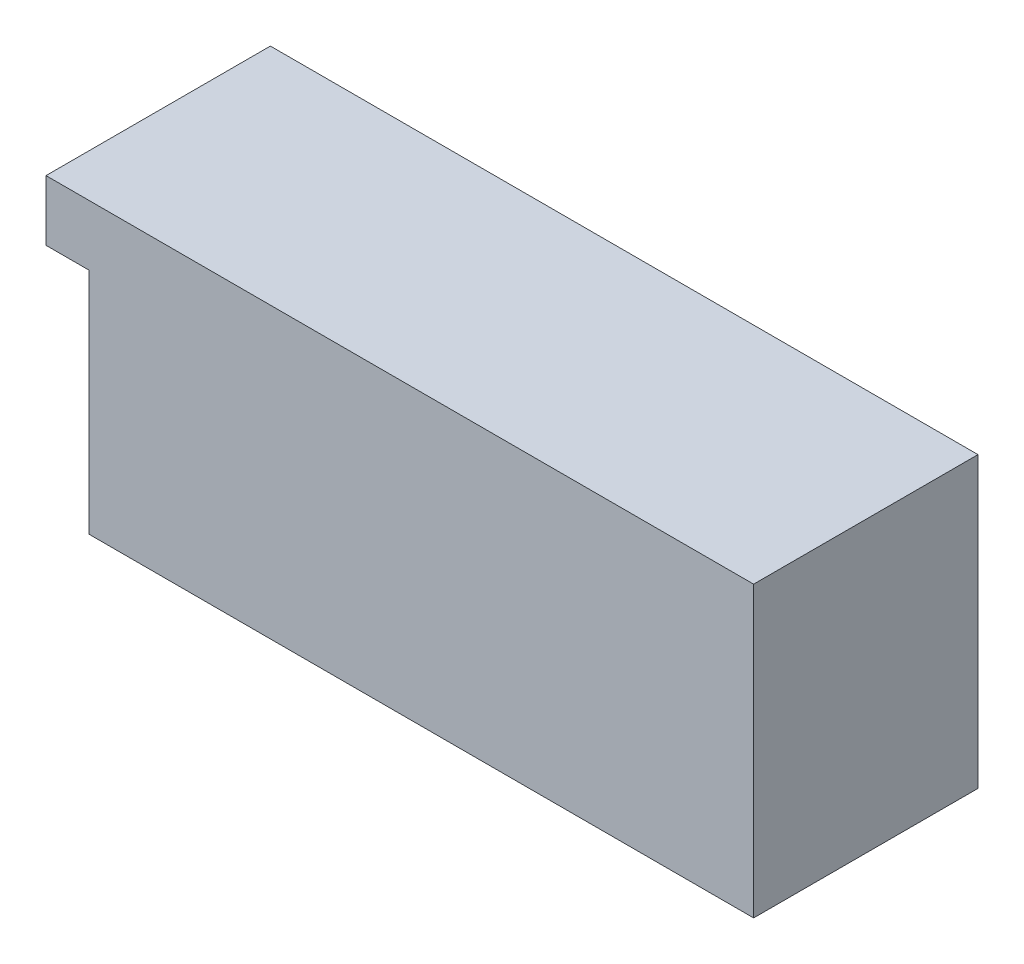
ISO-10303-21;
HEADER;
FILE_DESCRIPTION(('STEP AP214'),'2;1');
FILE_NAME('part.step','',(''),(''),'','','');
FILE_SCHEMA(('AUTOMOTIVE_DESIGN { 1 0 10303 214 1 1 1 1 }'));
ENDSEC;
DATA;
#1=APPLICATION_CONTEXT('core data for automotive mechanical design processes');
#2=APPLICATION_PROTOCOL_DEFINITION('international standard','automotive_design',2000,#1);
#3=PRODUCT_CONTEXT('',#1,'mechanical');
#4=PRODUCT('Part','Part','',(#3));
#5=PRODUCT_RELATED_PRODUCT_CATEGORY('part','',(#4));
#6=PRODUCT_DEFINITION_FORMATION('','',#4);
#7=PRODUCT_DEFINITION_CONTEXT('part definition',#1,'design');
#8=PRODUCT_DEFINITION('design','',#6,#7);
#9=PRODUCT_DEFINITION_SHAPE('','',#8);
#10=(LENGTH_UNIT() NAMED_UNIT(*) SI_UNIT(.MILLI.,.METRE.));
#11=(NAMED_UNIT(*) PLANE_ANGLE_UNIT() SI_UNIT($,.RADIAN.));
#12=(NAMED_UNIT(*) SI_UNIT($,.STERADIAN.) SOLID_ANGLE_UNIT());
#13=UNCERTAINTY_MEASURE_WITH_UNIT(LENGTH_MEASURE(1.E-05),#10,'distance_accuracy_value','');
#14=(GEOMETRIC_REPRESENTATION_CONTEXT(3) GLOBAL_UNCERTAINTY_ASSIGNED_CONTEXT((#13)) GLOBAL_UNIT_ASSIGNED_CONTEXT((#10,
#11,#12)) REPRESENTATION_CONTEXT('',''));
#15=CARTESIAN_POINT('',(0.,0.,0.));
#16=DIRECTION('',(0.,0.,1.));
#17=DIRECTION('',(1.,0.,0.));
#18=AXIS2_PLACEMENT_3D('',#15,#16,#17);
#19=CARTESIAN_POINT('',(-38.5,-16.75,26.));
#20=DIRECTION('',(1.,0.,0.));
#21=DIRECTION('',(0.,0.,-1.));
#22=AXIS2_PLACEMENT_3D('',#19,#20,#21);
#23=PLANE('',#22);
#24=DIRECTION('',(0.,0.,1.));
#25=VECTOR('',#24,1.);
#26=CARTESIAN_POINT('',(-38.5,9.75,0.));
#27=LINE('',#26,#25);
#28=CARTESIAN_POINT('',(-38.5,9.75,0.));
#29=VERTEX_POINT('',#28);
#30=CARTESIAN_POINT('',(-38.5,9.75,26.));
#31=VERTEX_POINT('',#30);
#32=EDGE_CURVE('E54',#29,#31,#27,.T.);
#33=ORIENTED_EDGE('',*,*,#32,.F.);
#34=DIRECTION('',(0.,-1.,0.));
#35=VECTOR('',#34,1.);
#36=CARTESIAN_POINT('',(-38.5,-16.75,0.));
#37=LINE('',#36,#35);
#38=CARTESIAN_POINT('',(-38.5,-16.75,0.));
#39=VERTEX_POINT('',#38);
#40=EDGE_CURVE('E122',#29,#39,#37,.T.);
#41=ORIENTED_EDGE('',*,*,#40,.T.);
#42=DIRECTION('',(0.,0.,-1.));
#43=VECTOR('',#42,1.);
#44=CARTESIAN_POINT('',(-38.5,-16.75,26.));
#45=LINE('',#44,#43);
#46=CARTESIAN_POINT('',(-38.5,-16.75,26.));
#47=VERTEX_POINT('',#46);
#48=EDGE_CURVE('E47',#47,#39,#45,.T.);
#49=ORIENTED_EDGE('',*,*,#48,.F.);
#50=DIRECTION('',(0.,-1.,0.));
#51=VECTOR('',#50,1.);
#52=CARTESIAN_POINT('',(-38.5,-16.75,26.));
#53=LINE('',#52,#51);
#54=EDGE_CURVE('E134',#31,#47,#53,.T.);
#55=ORIENTED_EDGE('',*,*,#54,.F.);
#56=EDGE_LOOP('',(#33,#41,#49,#55));
#57=FACE_BOUND('',#56,.T.);
#58=ADVANCED_FACE('F39',(#57),#23,.F.);
#59=CARTESIAN_POINT('',(38.5,-16.75,26.));
#60=DIRECTION('',(-1.,0.,0.));
#61=DIRECTION('',(0.,0.,1.));
#62=AXIS2_PLACEMENT_3D('',#59,#60,#61);
#63=PLANE('',#62);
#64=DIRECTION('',(0.,1.,0.));
#65=VECTOR('',#64,1.);
#66=CARTESIAN_POINT('',(38.5,-16.75,0.));
#67=LINE('',#66,#65);
#68=CARTESIAN_POINT('',(38.5,-16.75,0.));
#69=VERTEX_POINT('',#68);
#70=CARTESIAN_POINT('',(38.5,16.75,0.));
#71=VERTEX_POINT('',#70);
#72=EDGE_CURVE('E123',#69,#71,#67,.T.);
#73=ORIENTED_EDGE('',*,*,#72,.T.);
#74=DIRECTION('',(0.,0.,-1.));
#75=VECTOR('',#74,1.);
#76=CARTESIAN_POINT('',(38.5,16.75,26.));
#77=LINE('',#76,#75);
#78=CARTESIAN_POINT('',(38.5,16.75,26.));
#79=VERTEX_POINT('',#78);
#80=EDGE_CURVE('E11',#79,#71,#77,.T.);
#81=ORIENTED_EDGE('',*,*,#80,.F.);
#82=DIRECTION('',(0.,1.,0.));
#83=VECTOR('',#82,1.);
#84=CARTESIAN_POINT('',(38.5,-16.75,26.));
#85=LINE('',#84,#83);
#86=CARTESIAN_POINT('',(38.5,-16.75,26.));
#87=VERTEX_POINT('',#86);
#88=EDGE_CURVE('E131',#87,#79,#85,.T.);
#89=ORIENTED_EDGE('',*,*,#88,.F.);
#90=DIRECTION('',(0.,0.,-1.));
#91=VECTOR('',#90,1.);
#92=CARTESIAN_POINT('',(38.5,-16.75,26.));
#93=LINE('',#92,#91);
#94=EDGE_CURVE('E136',#87,#69,#93,.T.);
#95=ORIENTED_EDGE('',*,*,#94,.T.);
#96=EDGE_LOOP('',(#73,#81,#89,#95));
#97=FACE_BOUND('',#96,.T.);
#98=ADVANCED_FACE('F41',(#97),#63,.F.);
#99=CARTESIAN_POINT('',(-38.5,16.75,26.));
#100=DIRECTION('',(0.,-1.,0.));
#101=DIRECTION('',(0.,0.,-1.));
#102=AXIS2_PLACEMENT_3D('',#99,#100,#101);
#103=PLANE('',#102);
#104=DIRECTION('',(-1.,0.,0.));
#105=VECTOR('',#104,1.);
#106=CARTESIAN_POINT('',(-38.5,16.75,0.));
#107=LINE('',#106,#105);
#108=CARTESIAN_POINT('',(-43.5,16.75,0.));
#109=VERTEX_POINT('',#108);
#110=EDGE_CURVE('E126',#71,#109,#107,.T.);
#111=ORIENTED_EDGE('',*,*,#110,.T.);
#112=DIRECTION('',(0.,0.,-1.));
#113=VECTOR('',#112,1.);
#114=CARTESIAN_POINT('',(-43.5,16.75,0.));
#115=LINE('',#114,#113);
#116=CARTESIAN_POINT('',(-43.5,16.75,26.));
#117=VERTEX_POINT('',#116);
#118=EDGE_CURVE('E117',#117,#109,#115,.T.);
#119=ORIENTED_EDGE('',*,*,#118,.F.);
#120=DIRECTION('',(-1.,0.,0.));
#121=VECTOR('',#120,1.);
#122=CARTESIAN_POINT('',(-38.5,16.75,26.));
#123=LINE('',#122,#121);
#124=EDGE_CURVE('E85',#79,#117,#123,.T.);
#125=ORIENTED_EDGE('',*,*,#124,.F.);
#126=ORIENTED_EDGE('',*,*,#80,.T.);
#127=EDGE_LOOP('',(#111,#119,#125,#126));
#128=FACE_BOUND('',#127,.T.);
#129=ADVANCED_FACE('F148',(#128),#103,.F.);
#130=CARTESIAN_POINT('',(-38.5,-16.75,26.));
#131=DIRECTION('',(0.,1.,0.));
#132=DIRECTION('',(-1.,0.,0.));
#133=AXIS2_PLACEMENT_3D('',#130,#131,#132);
#134=PLANE('',#133);
#135=DIRECTION('',(1.,0.,0.));
#136=VECTOR('',#135,1.);
#137=CARTESIAN_POINT('',(-38.5,-16.75,0.));
#138=LINE('',#137,#136);
#139=EDGE_CURVE('E79',#39,#69,#138,.T.);
#140=ORIENTED_EDGE('',*,*,#139,.T.);
#141=ORIENTED_EDGE('',*,*,#94,.F.);
#142=DIRECTION('',(1.,0.,0.));
#143=VECTOR('',#142,1.);
#144=CARTESIAN_POINT('',(-38.5,-16.75,26.));
#145=LINE('',#144,#143);
#146=EDGE_CURVE('E63',#47,#87,#145,.T.);
#147=ORIENTED_EDGE('',*,*,#146,.F.);
#148=ORIENTED_EDGE('',*,*,#48,.T.);
#149=EDGE_LOOP('',(#140,#141,#147,#148));
#150=FACE_BOUND('',#149,.T.);
#151=ADVANCED_FACE('F142',(#150),#134,.F.);
#152=CARTESIAN_POINT('',(0.,0.,26.));
#153=DIRECTION('',(0.,0.,-1.));
#154=DIRECTION('',(-1.,0.,0.));
#155=AXIS2_PLACEMENT_3D('',#152,#153,#154);
#156=PLANE('',#155);
#157=ORIENTED_EDGE('',*,*,#88,.T.);
#158=ORIENTED_EDGE('',*,*,#124,.T.);
#159=DIRECTION('',(0.,1.,0.));
#160=VECTOR('',#159,1.);
#161=CARTESIAN_POINT('',(-43.5,16.75,26.));
#162=LINE('',#161,#160);
#163=CARTESIAN_POINT('',(-43.5,9.75,26.));
#164=VERTEX_POINT('',#163);
#165=EDGE_CURVE('E111',#164,#117,#162,.T.);
#166=ORIENTED_EDGE('',*,*,#165,.F.);
#167=DIRECTION('',(1.,0.,0.));
#168=VECTOR('',#167,1.);
#169=CARTESIAN_POINT('',(-43.5,9.75,26.));
#170=LINE('',#169,#168);
#171=EDGE_CURVE('E107',#164,#31,#170,.T.);
#172=ORIENTED_EDGE('',*,*,#171,.T.);
#173=ORIENTED_EDGE('',*,*,#54,.T.);
#174=ORIENTED_EDGE('',*,*,#146,.T.);
#175=EDGE_LOOP('',(#157,#158,#166,#172,#173,#174));
#176=FACE_BOUND('',#175,.T.);
#177=ADVANCED_FACE('F146',(#176),#156,.F.);
#178=CARTESIAN_POINT('',(0.,0.,0.));
#179=DIRECTION('',(0.,0.,-1.));
#180=DIRECTION('',(-1.,0.,0.));
#181=AXIS2_PLACEMENT_3D('',#178,#179,#180);
#182=PLANE('',#181);
#183=ORIENTED_EDGE('',*,*,#72,.F.);
#184=ORIENTED_EDGE('',*,*,#139,.F.);
#185=ORIENTED_EDGE('',*,*,#40,.F.);
#186=DIRECTION('',(1.,0.,0.));
#187=VECTOR('',#186,1.);
#188=CARTESIAN_POINT('',(-43.5,9.75,0.));
#189=LINE('',#188,#187);
#190=CARTESIAN_POINT('',(-43.5,9.75,0.));
#191=VERTEX_POINT('',#190);
#192=EDGE_CURVE('E105',#191,#29,#189,.T.);
#193=ORIENTED_EDGE('',*,*,#192,.F.);
#194=DIRECTION('',(0.,-1.,0.));
#195=VECTOR('',#194,1.);
#196=CARTESIAN_POINT('',(-43.5,16.75,0.));
#197=LINE('',#196,#195);
#198=EDGE_CURVE('E112',#109,#191,#197,.T.);
#199=ORIENTED_EDGE('',*,*,#198,.F.);
#200=ORIENTED_EDGE('',*,*,#110,.F.);
#201=EDGE_LOOP('',(#183,#184,#185,#193,#199,#200));
#202=FACE_BOUND('',#201,.T.);
#203=ADVANCED_FACE('F121',(#202),#182,.T.);
#204=CARTESIAN_POINT('',(-43.5,9.75,0.));
#205=DIRECTION('',(0.,1.,0.));
#206=DIRECTION('',(0.,0.,1.));
#207=AXIS2_PLACEMENT_3D('',#204,#205,#206);
#208=PLANE('',#207);
#209=ORIENTED_EDGE('',*,*,#32,.T.);
#210=ORIENTED_EDGE('',*,*,#171,.F.);
#211=DIRECTION('',(0.,0.,1.));
#212=VECTOR('',#211,1.);
#213=CARTESIAN_POINT('',(-43.5,9.75,0.));
#214=LINE('',#213,#212);
#215=EDGE_CURVE('E101',#191,#164,#214,.T.);
#216=ORIENTED_EDGE('',*,*,#215,.F.);
#217=ORIENTED_EDGE('',*,*,#192,.T.);
#218=EDGE_LOOP('',(#209,#210,#216,#217));
#219=FACE_BOUND('',#218,.T.);
#220=ADVANCED_FACE('F103',(#219),#208,.F.);
#221=CARTESIAN_POINT('',(-43.5,0.,0.));
#222=DIRECTION('',(-1.,0.,0.));
#223=DIRECTION('',(0.,0.,1.));
#224=AXIS2_PLACEMENT_3D('',#221,#222,#223);
#225=PLANE('',#224);
#226=ORIENTED_EDGE('',*,*,#198,.T.);
#227=ORIENTED_EDGE('',*,*,#215,.T.);
#228=ORIENTED_EDGE('',*,*,#165,.T.);
#229=ORIENTED_EDGE('',*,*,#118,.T.);
#230=EDGE_LOOP('',(#226,#227,#228,#229));
#231=FACE_BOUND('',#230,.T.);
#232=ADVANCED_FACE('F116',(#231),#225,.T.);
#233=CLOSED_SHELL('',(#58,#98,#129,#151,#177,#203,#220,#232));
#234=MANIFOLD_SOLID_BREP('B2',#233);
#235=ADVANCED_BREP_SHAPE_REPRESENTATION('',(#18,#234),#14);
#236=SHAPE_DEFINITION_REPRESENTATION(#9,#235);
ENDSEC;
END-ISO-10303-21;
